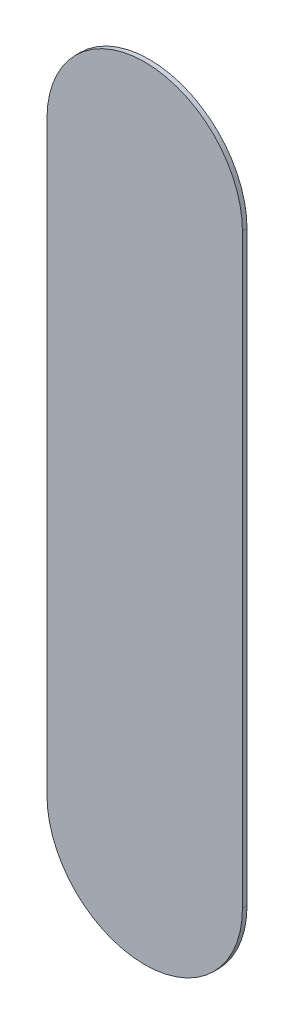
ISO-10303-21;
HEADER;
FILE_DESCRIPTION(('STEP AP214'),'2;1');
FILE_NAME('part.step','',(''),(''),'','','');
FILE_SCHEMA(('AUTOMOTIVE_DESIGN { 1 0 10303 214 1 1 1 1 }'));
ENDSEC;
DATA;
#1=APPLICATION_CONTEXT('core data for automotive mechanical design processes');
#2=APPLICATION_PROTOCOL_DEFINITION('international standard','automotive_design',2000,#1);
#3=PRODUCT_CONTEXT('',#1,'mechanical');
#4=PRODUCT('Part','Part','',(#3));
#5=PRODUCT_RELATED_PRODUCT_CATEGORY('part','',(#4));
#6=PRODUCT_DEFINITION_FORMATION('','',#4);
#7=PRODUCT_DEFINITION_CONTEXT('part definition',#1,'design');
#8=PRODUCT_DEFINITION('design','',#6,#7);
#9=PRODUCT_DEFINITION_SHAPE('','',#8);
#10=(LENGTH_UNIT() NAMED_UNIT(*) SI_UNIT(.MILLI.,.METRE.));
#11=(NAMED_UNIT(*) PLANE_ANGLE_UNIT() SI_UNIT($,.RADIAN.));
#12=(NAMED_UNIT(*) SI_UNIT($,.STERADIAN.) SOLID_ANGLE_UNIT());
#13=UNCERTAINTY_MEASURE_WITH_UNIT(LENGTH_MEASURE(1.E-05),#10,'distance_accuracy_value','');
#14=(GEOMETRIC_REPRESENTATION_CONTEXT(3) GLOBAL_UNCERTAINTY_ASSIGNED_CONTEXT((#13)) GLOBAL_UNIT_ASSIGNED_CONTEXT((#10,
#11,#12)) REPRESENTATION_CONTEXT('',''));
#15=CARTESIAN_POINT('',(0.,0.,0.));
#16=DIRECTION('',(0.,0.,1.));
#17=DIRECTION('',(1.,0.,0.));
#18=AXIS2_PLACEMENT_3D('',#15,#16,#17);
#19=CARTESIAN_POINT('',(6.5,-11.25,1.635));
#20=DIRECTION('',(0.,0.,1.));
#21=DIRECTION('',(1.,0.,0.));
#22=AXIS2_PLACEMENT_3D('',#19,#20,#21);
#23=PLANE('',#22);
#24=DIRECTION('',(0.,1.,0.));
#25=VECTOR('',#24,1.);
#26=CARTESIAN_POINT('',(6.5,-11.25,1.635));
#27=LINE('',#26,#25);
#28=CARTESIAN_POINT('',(6.5,-11.25,1.635));
#29=VERTEX_POINT('',#28);
#30=CARTESIAN_POINT('',(6.5,-6.75,1.635));
#31=VERTEX_POINT('',#30);
#32=EDGE_CURVE('E74',#29,#31,#27,.T.);
#33=ORIENTED_EDGE('',*,*,#32,.T.);
#34=CARTESIAN_POINT('',(5.75,-6.75,1.635));
#35=DIRECTION('',(0.,0.,1.));
#36=DIRECTION('',(1.,0.,0.));
#37=AXIS2_PLACEMENT_3D('',#34,#35,#36);
#38=CIRCLE('',#37,0.75);
#39=CARTESIAN_POINT('',(5.,-6.75,1.635));
#40=VERTEX_POINT('',#39);
#41=EDGE_CURVE('E100',#31,#40,#38,.T.);
#42=ORIENTED_EDGE('',*,*,#41,.T.);
#43=DIRECTION('',(0.,-1.,0.));
#44=VECTOR('',#43,1.);
#45=CARTESIAN_POINT('',(5.,-6.75,1.635));
#46=LINE('',#45,#44);
#47=CARTESIAN_POINT('',(5.,-11.25,1.635));
#48=VERTEX_POINT('',#47);
#49=EDGE_CURVE('E76',#40,#48,#46,.T.);
#50=ORIENTED_EDGE('',*,*,#49,.T.);
#51=CARTESIAN_POINT('',(5.75,-11.25,1.635));
#52=DIRECTION('',(0.,0.,1.));
#53=DIRECTION('',(-1.,0.,0.));
#54=AXIS2_PLACEMENT_3D('',#51,#52,#53);
#55=CIRCLE('',#54,0.75);
#56=EDGE_CURVE('E11',#48,#29,#55,.T.);
#57=ORIENTED_EDGE('',*,*,#56,.T.);
#58=EDGE_LOOP('',(#33,#42,#50,#57));
#59=FACE_BOUND('',#58,.T.);
#60=ADVANCED_FACE('F16',(#59),#23,.T.);
#61=CARTESIAN_POINT('',(6.5,-11.25,1.6));
#62=DIRECTION('',(0.,0.,1.));
#63=DIRECTION('',(1.,0.,0.));
#64=AXIS2_PLACEMENT_3D('',#61,#62,#63);
#65=PLANE('',#64);
#66=CARTESIAN_POINT('',(5.75,-11.25,1.6));
#67=DIRECTION('',(0.,0.,1.));
#68=DIRECTION('',(-1.,0.,0.));
#69=AXIS2_PLACEMENT_3D('',#66,#67,#68);
#70=CIRCLE('',#69,0.75);
#71=CARTESIAN_POINT('',(5.,-11.25,1.6));
#72=VERTEX_POINT('',#71);
#73=CARTESIAN_POINT('',(6.5,-11.25,1.6));
#74=VERTEX_POINT('',#73);
#75=EDGE_CURVE('E27',#72,#74,#70,.T.);
#76=ORIENTED_EDGE('',*,*,#75,.F.);
#77=DIRECTION('',(0.,-1.,0.));
#78=VECTOR('',#77,1.);
#79=CARTESIAN_POINT('',(5.,-6.75,1.6));
#80=LINE('',#79,#78);
#81=CARTESIAN_POINT('',(5.,-6.75,1.6));
#82=VERTEX_POINT('',#81);
#83=EDGE_CURVE('E66',#82,#72,#80,.T.);
#84=ORIENTED_EDGE('',*,*,#83,.F.);
#85=CARTESIAN_POINT('',(5.75,-6.75,1.6));
#86=DIRECTION('',(0.,0.,1.));
#87=DIRECTION('',(1.,0.,0.));
#88=AXIS2_PLACEMENT_3D('',#85,#86,#87);
#89=CIRCLE('',#88,0.75);
#90=CARTESIAN_POINT('',(6.5,-6.75,1.6));
#91=VERTEX_POINT('',#90);
#92=EDGE_CURVE('E85',#91,#82,#89,.T.);
#93=ORIENTED_EDGE('',*,*,#92,.F.);
#94=DIRECTION('',(0.,1.,0.));
#95=VECTOR('',#94,1.);
#96=CARTESIAN_POINT('',(6.5,-11.25,1.6));
#97=LINE('',#96,#95);
#98=EDGE_CURVE('E96',#74,#91,#97,.T.);
#99=ORIENTED_EDGE('',*,*,#98,.F.);
#100=EDGE_LOOP('',(#76,#84,#93,#99));
#101=FACE_BOUND('',#100,.T.);
#102=ADVANCED_FACE('F18',(#101),#65,.F.);
#103=CARTESIAN_POINT('',(5.75,-11.25,1.6));
#104=DIRECTION('',(0.,0.,-1.));
#105=DIRECTION('',(-1.,0.,0.));
#106=AXIS2_PLACEMENT_3D('',#103,#104,#105);
#107=CYLINDRICAL_SURFACE('',#106,0.75);
#108=ORIENTED_EDGE('',*,*,#75,.T.);
#109=DIRECTION('',(0.,0.,1.));
#110=VECTOR('',#109,1.);
#111=CARTESIAN_POINT('',(6.5,-11.25,1.6));
#112=LINE('',#111,#110);
#113=EDGE_CURVE('E79',#74,#29,#112,.T.);
#114=ORIENTED_EDGE('',*,*,#113,.T.);
#115=ORIENTED_EDGE('',*,*,#56,.F.);
#116=DIRECTION('',(0.,0.,1.));
#117=VECTOR('',#116,1.);
#118=CARTESIAN_POINT('',(5.,-11.25,1.6));
#119=LINE('',#118,#117);
#120=EDGE_CURVE('E20',#72,#48,#119,.T.);
#121=ORIENTED_EDGE('',*,*,#120,.F.);
#122=EDGE_LOOP('',(#108,#114,#115,#121));
#123=FACE_BOUND('',#122,.T.);
#124=ADVANCED_FACE('F80',(#123),#107,.T.);
#125=CARTESIAN_POINT('',(5.,-6.75,1.6));
#126=DIRECTION('',(1.,0.,0.));
#127=DIRECTION('',(0.,1.,0.));
#128=AXIS2_PLACEMENT_3D('',#125,#126,#127);
#129=PLANE('',#128);
#130=ORIENTED_EDGE('',*,*,#83,.T.);
#131=ORIENTED_EDGE('',*,*,#120,.T.);
#132=ORIENTED_EDGE('',*,*,#49,.F.);
#133=DIRECTION('',(0.,0.,1.));
#134=VECTOR('',#133,1.);
#135=CARTESIAN_POINT('',(5.,-6.75,1.6));
#136=LINE('',#135,#134);
#137=EDGE_CURVE('E103',#82,#40,#136,.T.);
#138=ORIENTED_EDGE('',*,*,#137,.F.);
#139=EDGE_LOOP('',(#130,#131,#132,#138));
#140=FACE_BOUND('',#139,.T.);
#141=ADVANCED_FACE('F127',(#140),#129,.F.);
#142=CARTESIAN_POINT('',(5.75,-6.75,1.6));
#143=DIRECTION('',(0.,0.,-1.));
#144=DIRECTION('',(1.,0.,0.));
#145=AXIS2_PLACEMENT_3D('',#142,#143,#144);
#146=CYLINDRICAL_SURFACE('',#145,0.75);
#147=ORIENTED_EDGE('',*,*,#92,.T.);
#148=ORIENTED_EDGE('',*,*,#137,.T.);
#149=ORIENTED_EDGE('',*,*,#41,.F.);
#150=DIRECTION('',(0.,0.,1.));
#151=VECTOR('',#150,1.);
#152=CARTESIAN_POINT('',(6.5,-6.75,1.6));
#153=LINE('',#152,#151);
#154=EDGE_CURVE('E89',#91,#31,#153,.T.);
#155=ORIENTED_EDGE('',*,*,#154,.F.);
#156=EDGE_LOOP('',(#147,#148,#149,#155));
#157=FACE_BOUND('',#156,.T.);
#158=ADVANCED_FACE('F126',(#157),#146,.T.);
#159=CARTESIAN_POINT('',(6.5,-11.25,1.6));
#160=DIRECTION('',(-1.,0.,0.));
#161=DIRECTION('',(0.,0.,1.));
#162=AXIS2_PLACEMENT_3D('',#159,#160,#161);
#163=PLANE('',#162);
#164=ORIENTED_EDGE('',*,*,#98,.T.);
#165=ORIENTED_EDGE('',*,*,#154,.T.);
#166=ORIENTED_EDGE('',*,*,#32,.F.);
#167=ORIENTED_EDGE('',*,*,#113,.F.);
#168=EDGE_LOOP('',(#164,#165,#166,#167));
#169=FACE_BOUND('',#168,.T.);
#170=ADVANCED_FACE('F87',(#169),#163,.F.);
#171=CLOSED_SHELL('',(#60,#102,#124,#141,#158,#170));
#172=MANIFOLD_SOLID_BREP('B1',#171);
#173=ADVANCED_BREP_SHAPE_REPRESENTATION('',(#18,#172),#14);
#174=SHAPE_DEFINITION_REPRESENTATION(#9,#173);
ENDSEC;
END-ISO-10303-21;
